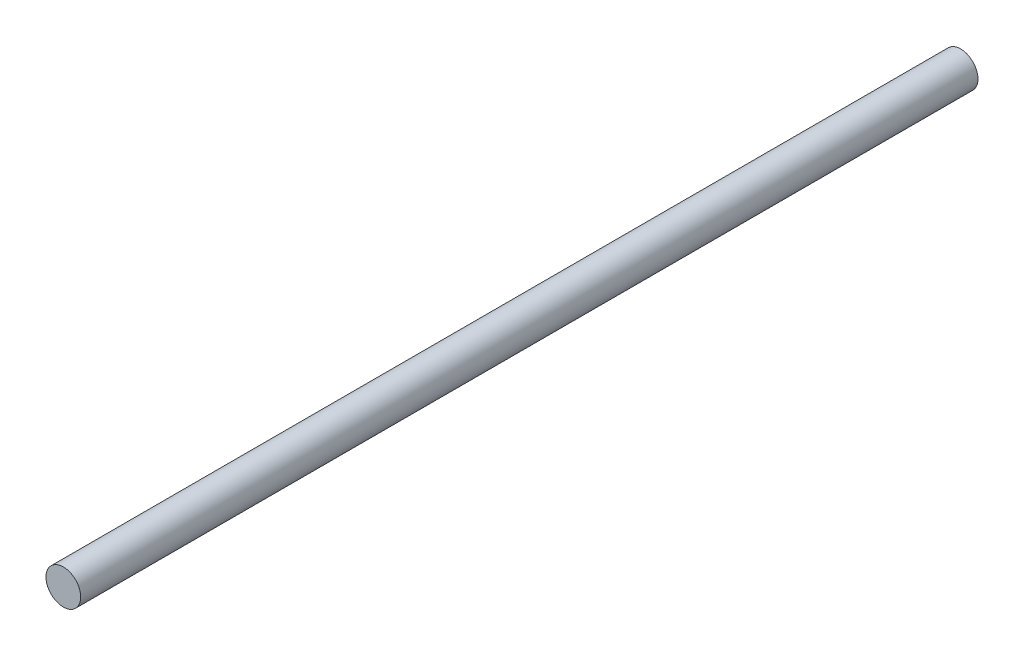
ISO-10303-21;
HEADER;
FILE_DESCRIPTION(('STEP AP214'),'2;1');
FILE_NAME('part.step','',(''),(''),'','','');
FILE_SCHEMA(('AUTOMOTIVE_DESIGN { 1 0 10303 214 1 1 1 1 }'));
ENDSEC;
DATA;
#1=APPLICATION_CONTEXT('core data for automotive mechanical design processes');
#2=APPLICATION_PROTOCOL_DEFINITION('international standard','automotive_design',2000,#1);
#3=PRODUCT_CONTEXT('',#1,'mechanical');
#4=PRODUCT('Part','Part','',(#3));
#5=PRODUCT_RELATED_PRODUCT_CATEGORY('part','',(#4));
#6=PRODUCT_DEFINITION_FORMATION('','',#4);
#7=PRODUCT_DEFINITION_CONTEXT('part definition',#1,'design');
#8=PRODUCT_DEFINITION('design','',#6,#7);
#9=PRODUCT_DEFINITION_SHAPE('','',#8);
#10=(LENGTH_UNIT() NAMED_UNIT(*) SI_UNIT(.MILLI.,.METRE.));
#11=(NAMED_UNIT(*) PLANE_ANGLE_UNIT() SI_UNIT($,.RADIAN.));
#12=(NAMED_UNIT(*) SI_UNIT($,.STERADIAN.) SOLID_ANGLE_UNIT());
#13=UNCERTAINTY_MEASURE_WITH_UNIT(LENGTH_MEASURE(1.E-05),#10,'distance_accuracy_value','');
#14=(GEOMETRIC_REPRESENTATION_CONTEXT(3) GLOBAL_UNCERTAINTY_ASSIGNED_CONTEXT((#13)) GLOBAL_UNIT_ASSIGNED_CONTEXT((#10,
#11,#12)) REPRESENTATION_CONTEXT('',''));
#15=CARTESIAN_POINT('',(0.,0.,0.));
#16=DIRECTION('',(0.,0.,1.));
#17=DIRECTION('',(1.,0.,0.));
#18=AXIS2_PLACEMENT_3D('',#15,#16,#17);
#19=CARTESIAN_POINT('',(0.,0.,155.));
#20=DIRECTION('',(0.,0.,-1.));
#21=DIRECTION('',(-1.,0.,0.));
#22=AXIS2_PLACEMENT_3D('',#19,#20,#21);
#23=CYLINDRICAL_SURFACE('',#22,3.);
#24=CARTESIAN_POINT('',(0.,0.,155.));
#25=DIRECTION('',(0.,0.,1.));
#26=DIRECTION('',(1.,0.,0.));
#27=AXIS2_PLACEMENT_3D('',#24,#25,#26);
#28=CIRCLE('',#27,3.);
#29=CARTESIAN_POINT('',(3.,0.,155.));
#30=VERTEX_POINT('',#29);
#31=EDGE_CURVE('E10',#30,#30,#28,.T.);
#32=ORIENTED_EDGE('',*,*,#31,.F.);
#33=EDGE_LOOP('',(#32));
#34=FACE_BOUND('',#33,.T.);
#35=CARTESIAN_POINT('',(0.,0.,0.));
#36=DIRECTION('',(0.,0.,1.));
#37=DIRECTION('',(1.,0.,0.));
#38=AXIS2_PLACEMENT_3D('',#35,#36,#37);
#39=CIRCLE('',#38,3.);
#40=CARTESIAN_POINT('',(3.,0.,0.));
#41=VERTEX_POINT('',#40);
#42=EDGE_CURVE('E39',#41,#41,#39,.T.);
#43=ORIENTED_EDGE('',*,*,#42,.T.);
#44=EDGE_LOOP('',(#43));
#45=FACE_BOUND('',#44,.T.);
#46=ADVANCED_FACE('F36',(#34,#45),#23,.T.);
#47=CARTESIAN_POINT('',(0.,0.,155.));
#48=DIRECTION('',(0.,0.,1.));
#49=DIRECTION('',(1.,0.,0.));
#50=AXIS2_PLACEMENT_3D('',#47,#48,#49);
#51=PLANE('',#50);
#52=ORIENTED_EDGE('',*,*,#31,.T.);
#53=EDGE_LOOP('',(#52));
#54=FACE_BOUND('',#53,.T.);
#55=ADVANCED_FACE('F51',(#54),#51,.T.);
#56=CARTESIAN_POINT('',(0.,0.,0.));
#57=DIRECTION('',(0.,0.,1.));
#58=DIRECTION('',(1.,0.,0.));
#59=AXIS2_PLACEMENT_3D('',#56,#57,#58);
#60=PLANE('',#59);
#61=ORIENTED_EDGE('',*,*,#42,.F.);
#62=EDGE_LOOP('',(#61));
#63=FACE_BOUND('',#62,.T.);
#64=ADVANCED_FACE('F49',(#63),#60,.F.);
#65=CLOSED_SHELL('',(#46,#55,#64));
#66=MANIFOLD_SOLID_BREP('B2',#65);
#67=ADVANCED_BREP_SHAPE_REPRESENTATION('',(#18,#66),#14);
#68=SHAPE_DEFINITION_REPRESENTATION(#9,#67);
ENDSEC;
END-ISO-10303-21;
